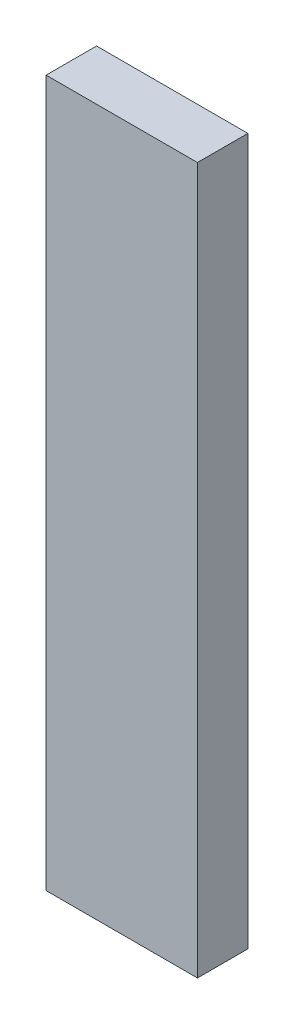
ISO-10303-21;
HEADER;
FILE_DESCRIPTION(('STEP AP214'),'2;1');
FILE_NAME('part.step','',(''),(''),'','','');
FILE_SCHEMA(('AUTOMOTIVE_DESIGN { 1 0 10303 214 1 1 1 1 }'));
ENDSEC;
DATA;
#1=APPLICATION_CONTEXT('core data for automotive mechanical design processes');
#2=APPLICATION_PROTOCOL_DEFINITION('international standard','automotive_design',2000,#1);
#3=PRODUCT_CONTEXT('',#1,'mechanical');
#4=PRODUCT('Part','Part','',(#3));
#5=PRODUCT_RELATED_PRODUCT_CATEGORY('part','',(#4));
#6=PRODUCT_DEFINITION_FORMATION('','',#4);
#7=PRODUCT_DEFINITION_CONTEXT('part definition',#1,'design');
#8=PRODUCT_DEFINITION('design','',#6,#7);
#9=PRODUCT_DEFINITION_SHAPE('','',#8);
#10=(LENGTH_UNIT() NAMED_UNIT(*) SI_UNIT(.MILLI.,.METRE.));
#11=(NAMED_UNIT(*) PLANE_ANGLE_UNIT() SI_UNIT($,.RADIAN.));
#12=(NAMED_UNIT(*) SI_UNIT($,.STERADIAN.) SOLID_ANGLE_UNIT());
#13=UNCERTAINTY_MEASURE_WITH_UNIT(LENGTH_MEASURE(1.E-05),#10,'distance_accuracy_value','');
#14=(GEOMETRIC_REPRESENTATION_CONTEXT(3) GLOBAL_UNCERTAINTY_ASSIGNED_CONTEXT((#13)) GLOBAL_UNIT_ASSIGNED_CONTEXT((#10,
#11,#12)) REPRESENTATION_CONTEXT('',''));
#15=CARTESIAN_POINT('',(0.,0.,0.));
#16=DIRECTION('',(0.,0.,1.));
#17=DIRECTION('',(1.,0.,0.));
#18=AXIS2_PLACEMENT_3D('',#15,#16,#17);
#19=CARTESIAN_POINT('',(0.,0.,0.2));
#20=DIRECTION('',(0.,0.,1.));
#21=DIRECTION('',(1.,0.,0.));
#22=AXIS2_PLACEMENT_3D('',#19,#20,#21);
#23=PLANE('',#22);
#24=DIRECTION('',(0.,1.,0.));
#25=VECTOR('',#24,1.);
#26=CARTESIAN_POINT('',(0.3,-1.4,0.2));
#27=LINE('',#26,#25);
#28=CARTESIAN_POINT('',(0.3,-1.4,0.2));
#29=VERTEX_POINT('',#28);
#30=CARTESIAN_POINT('',(0.3,1.4,0.2));
#31=VERTEX_POINT('',#30);
#32=EDGE_CURVE('E77',#29,#31,#27,.T.);
#33=ORIENTED_EDGE('',*,*,#32,.T.);
#34=DIRECTION('',(1.,0.,0.));
#35=VECTOR('',#34,1.);
#36=CARTESIAN_POINT('',(0.,1.4,0.2));
#37=LINE('',#36,#35);
#38=CARTESIAN_POINT('',(-0.3,1.4,0.2));
#39=VERTEX_POINT('',#38);
#40=EDGE_CURVE('E20',#31,#39,#37,.F.);
#41=ORIENTED_EDGE('',*,*,#40,.T.);
#42=DIRECTION('',(0.,1.,0.));
#43=VECTOR('',#42,1.);
#44=CARTESIAN_POINT('',(-0.3,1.4,0.2));
#45=LINE('',#44,#43);
#46=CARTESIAN_POINT('',(-0.3,-1.4,0.2));
#47=VERTEX_POINT('',#46);
#48=EDGE_CURVE('E58',#39,#47,#45,.F.);
#49=ORIENTED_EDGE('',*,*,#48,.T.);
#50=DIRECTION('',(1.,0.,0.));
#51=VECTOR('',#50,1.);
#52=CARTESIAN_POINT('',(-0.3,-1.4,0.2));
#53=LINE('',#52,#51);
#54=EDGE_CURVE('E55',#47,#29,#53,.T.);
#55=ORIENTED_EDGE('',*,*,#54,.T.);
#56=EDGE_LOOP('',(#33,#41,#49,#55));
#57=FACE_BOUND('',#56,.T.);
#58=ADVANCED_FACE('F17',(#57),#23,.T.);
#59=CARTESIAN_POINT('',(-0.3,1.4,0.));
#60=DIRECTION('',(1.,0.,0.));
#61=DIRECTION('',(0.,0.,-1.));
#62=AXIS2_PLACEMENT_3D('',#59,#60,#61);
#63=PLANE('',#62);
#64=DIRECTION('',(0.,0.,1.));
#65=VECTOR('',#64,1.);
#66=CARTESIAN_POINT('',(-0.3,-1.4,0.));
#67=LINE('',#66,#65);
#68=CARTESIAN_POINT('',(-0.3,-1.4,0.));
#69=VERTEX_POINT('',#68);
#70=EDGE_CURVE('E63',#69,#47,#67,.T.);
#71=ORIENTED_EDGE('',*,*,#70,.T.);
#72=ORIENTED_EDGE('',*,*,#48,.F.);
#73=DIRECTION('',(0.,0.,-1.));
#74=VECTOR('',#73,1.);
#75=CARTESIAN_POINT('',(-0.3,1.4,0.));
#76=LINE('',#75,#74);
#77=CARTESIAN_POINT('',(-0.3,1.4,0.));
#78=VERTEX_POINT('',#77);
#79=EDGE_CURVE('E80',#39,#78,#76,.T.);
#80=ORIENTED_EDGE('',*,*,#79,.T.);
#81=DIRECTION('',(0.,1.,0.));
#82=VECTOR('',#81,1.);
#83=CARTESIAN_POINT('',(-0.3,0.,0.));
#84=LINE('',#83,#82);
#85=EDGE_CURVE('E73',#78,#69,#84,.F.);
#86=ORIENTED_EDGE('',*,*,#85,.T.);
#87=EDGE_LOOP('',(#71,#72,#80,#86));
#88=FACE_BOUND('',#87,.T.);
#89=ADVANCED_FACE('F72',(#88),#63,.F.);
#90=CARTESIAN_POINT('',(-0.3,-1.4,0.));
#91=DIRECTION('',(0.,1.,0.));
#92=DIRECTION('',(0.,0.,1.));
#93=AXIS2_PLACEMENT_3D('',#90,#91,#92);
#94=PLANE('',#93);
#95=DIRECTION('',(0.,0.,1.));
#96=VECTOR('',#95,1.);
#97=CARTESIAN_POINT('',(0.3,-1.4,0.));
#98=LINE('',#97,#96);
#99=CARTESIAN_POINT('',(0.3,-1.4,0.));
#100=VERTEX_POINT('',#99);
#101=EDGE_CURVE('E69',#100,#29,#98,.T.);
#102=ORIENTED_EDGE('',*,*,#101,.T.);
#103=ORIENTED_EDGE('',*,*,#54,.F.);
#104=ORIENTED_EDGE('',*,*,#70,.F.);
#105=DIRECTION('',(1.,0.,0.));
#106=VECTOR('',#105,1.);
#107=CARTESIAN_POINT('',(0.,-1.4,0.));
#108=LINE('',#107,#106);
#109=EDGE_CURVE('E83',#69,#100,#108,.T.);
#110=ORIENTED_EDGE('',*,*,#109,.T.);
#111=EDGE_LOOP('',(#102,#103,#104,#110));
#112=FACE_BOUND('',#111,.T.);
#113=ADVANCED_FACE('F66',(#112),#94,.F.);
#114=CARTESIAN_POINT('',(0.3,-1.4,0.));
#115=DIRECTION('',(-1.,0.,0.));
#116=DIRECTION('',(0.,0.,1.));
#117=AXIS2_PLACEMENT_3D('',#114,#115,#116);
#118=PLANE('',#117);
#119=DIRECTION('',(0.,0.,-1.));
#120=VECTOR('',#119,1.);
#121=CARTESIAN_POINT('',(0.3,1.4,0.));
#122=LINE('',#121,#120);
#123=CARTESIAN_POINT('',(0.3,1.4,0.));
#124=VERTEX_POINT('',#123);
#125=EDGE_CURVE('E34',#124,#31,#122,.F.);
#126=ORIENTED_EDGE('',*,*,#125,.T.);
#127=ORIENTED_EDGE('',*,*,#32,.F.);
#128=ORIENTED_EDGE('',*,*,#101,.F.);
#129=DIRECTION('',(0.,1.,0.));
#130=VECTOR('',#129,1.);
#131=CARTESIAN_POINT('',(0.3,0.,0.));
#132=LINE('',#131,#130);
#133=EDGE_CURVE('E26',#100,#124,#132,.T.);
#134=ORIENTED_EDGE('',*,*,#133,.T.);
#135=EDGE_LOOP('',(#126,#127,#128,#134));
#136=FACE_BOUND('',#135,.T.);
#137=ADVANCED_FACE('F88',(#136),#118,.F.);
#138=CARTESIAN_POINT('',(0.3,1.4,0.));
#139=DIRECTION('',(0.,-1.,0.));
#140=DIRECTION('',(0.,0.,-1.));
#141=AXIS2_PLACEMENT_3D('',#138,#139,#140);
#142=PLANE('',#141);
#143=ORIENTED_EDGE('',*,*,#79,.F.);
#144=ORIENTED_EDGE('',*,*,#40,.F.);
#145=ORIENTED_EDGE('',*,*,#125,.F.);
#146=DIRECTION('',(1.,0.,0.));
#147=VECTOR('',#146,1.);
#148=CARTESIAN_POINT('',(0.,1.4,0.));
#149=LINE('',#148,#147);
#150=EDGE_CURVE('E11',#124,#78,#149,.F.);
#151=ORIENTED_EDGE('',*,*,#150,.T.);
#152=EDGE_LOOP('',(#143,#144,#145,#151));
#153=FACE_BOUND('',#152,.T.);
#154=ADVANCED_FACE('F91',(#153),#142,.F.);
#155=CARTESIAN_POINT('',(0.,0.,0.));
#156=DIRECTION('',(0.,0.,1.));
#157=DIRECTION('',(1.,0.,0.));
#158=AXIS2_PLACEMENT_3D('',#155,#156,#157);
#159=PLANE('',#158);
#160=ORIENTED_EDGE('',*,*,#133,.F.);
#161=ORIENTED_EDGE('',*,*,#109,.F.);
#162=ORIENTED_EDGE('',*,*,#85,.F.);
#163=ORIENTED_EDGE('',*,*,#150,.F.);
#164=EDGE_LOOP('',(#160,#161,#162,#163));
#165=FACE_BOUND('',#164,.T.);
#166=ADVANCED_FACE('F90',(#165),#159,.F.);
#167=CLOSED_SHELL('',(#58,#89,#113,#137,#154,#166));
#168=MANIFOLD_SOLID_BREP('B1',#167);
#169=ADVANCED_BREP_SHAPE_REPRESENTATION('',(#18,#168),#14);
#170=SHAPE_DEFINITION_REPRESENTATION(#9,#169);
ENDSEC;
END-ISO-10303-21;
